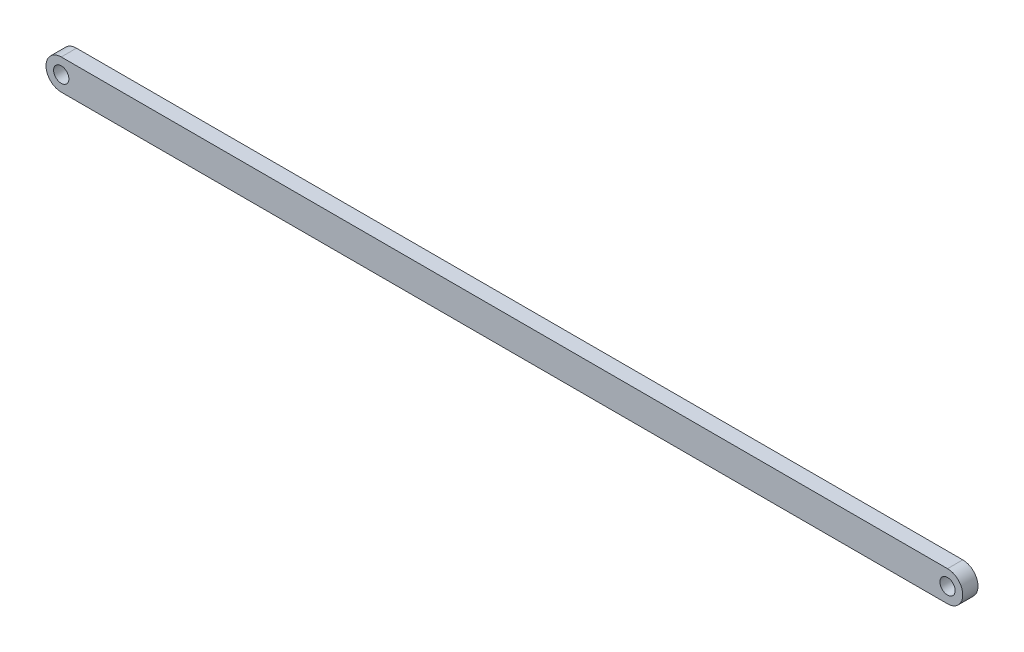
ISO-10303-21;
HEADER;
FILE_DESCRIPTION(('STEP AP214'),'2;1');
FILE_NAME('part.step','',(''),(''),'','','');
FILE_SCHEMA(('AUTOMOTIVE_DESIGN { 1 0 10303 214 1 1 1 1 }'));
ENDSEC;
DATA;
#1=APPLICATION_CONTEXT('core data for automotive mechanical design processes');
#2=APPLICATION_PROTOCOL_DEFINITION('international standard','automotive_design',2000,#1);
#3=PRODUCT_CONTEXT('',#1,'mechanical');
#4=PRODUCT('Part','Part','',(#3));
#5=PRODUCT_RELATED_PRODUCT_CATEGORY('part','',(#4));
#6=PRODUCT_DEFINITION_FORMATION('','',#4);
#7=PRODUCT_DEFINITION_CONTEXT('part definition',#1,'design');
#8=PRODUCT_DEFINITION('design','',#6,#7);
#9=PRODUCT_DEFINITION_SHAPE('','',#8);
#10=(LENGTH_UNIT() NAMED_UNIT(*) SI_UNIT(.MILLI.,.METRE.));
#11=(NAMED_UNIT(*) PLANE_ANGLE_UNIT() SI_UNIT($,.RADIAN.));
#12=(NAMED_UNIT(*) SI_UNIT($,.STERADIAN.) SOLID_ANGLE_UNIT());
#13=UNCERTAINTY_MEASURE_WITH_UNIT(LENGTH_MEASURE(1.E-05),#10,'distance_accuracy_value','');
#14=(GEOMETRIC_REPRESENTATION_CONTEXT(3) GLOBAL_UNCERTAINTY_ASSIGNED_CONTEXT((#13)) GLOBAL_UNIT_ASSIGNED_CONTEXT((#10,
#11,#12)) REPRESENTATION_CONTEXT('',''));
#15=CARTESIAN_POINT('',(0.,0.,0.));
#16=DIRECTION('',(0.,0.,1.));
#17=DIRECTION('',(1.,0.,0.));
#18=AXIS2_PLACEMENT_3D('',#15,#16,#17);
#19=CARTESIAN_POINT('',(145.38,0.,5.));
#20=DIRECTION('',(0.,0.,-1.));
#21=DIRECTION('',(-1.,0.,0.));
#22=AXIS2_PLACEMENT_3D('',#19,#20,#21);
#23=PLANE('',#22);
#24=CARTESIAN_POINT('',(145.38,0.,5.));
#25=DIRECTION('',(0.,0.,1.));
#26=DIRECTION('',(-1.,0.,0.));
#27=AXIS2_PLACEMENT_3D('',#24,#25,#26);
#28=CIRCLE('',#27,5.00000000000005);
#29=CARTESIAN_POINT('',(145.38,-5.00000000000005,5.));
#30=VERTEX_POINT('',#29);
#31=CARTESIAN_POINT('',(145.38,5.00000000000005,5.));
#32=VERTEX_POINT('',#31);
#33=EDGE_CURVE('E96',#30,#32,#28,.T.);
#34=ORIENTED_EDGE('',*,*,#33,.T.);
#35=DIRECTION('',(-1.,0.,0.));
#36=VECTOR('',#35,1.);
#37=CARTESIAN_POINT('',(-145.38,5.,5.));
#38=LINE('',#37,#36);
#39=CARTESIAN_POINT('',(-145.38,5.,5.));
#40=VERTEX_POINT('',#39);
#41=EDGE_CURVE('E91',#32,#40,#38,.T.);
#42=ORIENTED_EDGE('',*,*,#41,.T.);
#43=CARTESIAN_POINT('',(-145.38,0.,5.));
#44=DIRECTION('',(0.,0.,1.));
#45=DIRECTION('',(1.,0.,0.));
#46=AXIS2_PLACEMENT_3D('',#43,#44,#45);
#47=CIRCLE('',#46,5.00000000000005);
#48=CARTESIAN_POINT('',(-145.38,-5.00000000000005,5.));
#49=VERTEX_POINT('',#48);
#50=EDGE_CURVE('E94',#40,#49,#47,.T.);
#51=ORIENTED_EDGE('',*,*,#50,.T.);
#52=DIRECTION('',(1.,0.,0.));
#53=VECTOR('',#52,1.);
#54=CARTESIAN_POINT('',(-145.38,-5.00000000000011,5.));
#55=LINE('',#54,#53);
#56=EDGE_CURVE('E61',#49,#30,#55,.T.);
#57=ORIENTED_EDGE('',*,*,#56,.T.);
#58=EDGE_LOOP('',(#34,#42,#51,#57));
#59=FACE_BOUND('',#58,.T.);
#60=CARTESIAN_POINT('',(-145.38,0.,5.));
#61=DIRECTION('',(0.,0.,1.));
#62=DIRECTION('',(1.,0.,0.));
#63=AXIS2_PLACEMENT_3D('',#60,#61,#62);
#64=CIRCLE('',#63,2.5);
#65=CARTESIAN_POINT('',(-142.88,0.,5.));
#66=VERTEX_POINT('',#65);
#67=EDGE_CURVE('E116',#66,#66,#64,.T.);
#68=ORIENTED_EDGE('',*,*,#67,.F.);
#69=EDGE_LOOP('',(#68));
#70=FACE_BOUND('',#69,.T.);
#71=CARTESIAN_POINT('',(145.38,0.,5.));
#72=DIRECTION('',(0.,0.,1.));
#73=DIRECTION('',(1.,0.,0.));
#74=AXIS2_PLACEMENT_3D('',#71,#72,#73);
#75=CIRCLE('',#74,2.5);
#76=CARTESIAN_POINT('',(147.88,0.,5.));
#77=VERTEX_POINT('',#76);
#78=EDGE_CURVE('E138',#77,#77,#75,.T.);
#79=ORIENTED_EDGE('',*,*,#78,.F.);
#80=EDGE_LOOP('',(#79));
#81=FACE_BOUND('',#80,.T.);
#82=ADVANCED_FACE('F43',(#59,#70,#81),#23,.F.);
#83=CARTESIAN_POINT('',(145.38,0.,0.));
#84=DIRECTION('',(0.,0.,-1.));
#85=DIRECTION('',(-1.,0.,0.));
#86=AXIS2_PLACEMENT_3D('',#83,#84,#85);
#87=PLANE('',#86);
#88=CARTESIAN_POINT('',(-145.38,0.,0.));
#89=DIRECTION('',(0.,0.,1.));
#90=DIRECTION('',(1.,0.,0.));
#91=AXIS2_PLACEMENT_3D('',#88,#89,#90);
#92=CIRCLE('',#91,2.5);
#93=CARTESIAN_POINT('',(-142.88,0.,0.));
#94=VERTEX_POINT('',#93);
#95=EDGE_CURVE('E134',#94,#94,#92,.T.);
#96=ORIENTED_EDGE('',*,*,#95,.T.);
#97=EDGE_LOOP('',(#96));
#98=FACE_BOUND('',#97,.T.);
#99=CARTESIAN_POINT('',(145.38,0.,0.));
#100=DIRECTION('',(0.,0.,1.));
#101=DIRECTION('',(-1.,0.,0.));
#102=AXIS2_PLACEMENT_3D('',#99,#100,#101);
#103=CIRCLE('',#102,5.00000000000005);
#104=CARTESIAN_POINT('',(145.38,-5.00000000000005,0.));
#105=VERTEX_POINT('',#104);
#106=CARTESIAN_POINT('',(145.38,5.00000000000005,0.));
#107=VERTEX_POINT('',#106);
#108=EDGE_CURVE('E112',#105,#107,#103,.T.);
#109=ORIENTED_EDGE('',*,*,#108,.F.);
#110=DIRECTION('',(1.,0.,0.));
#111=VECTOR('',#110,1.);
#112=CARTESIAN_POINT('',(-145.38,-5.00000000000011,0.));
#113=LINE('',#112,#111);
#114=CARTESIAN_POINT('',(-145.38,-5.00000000000005,0.));
#115=VERTEX_POINT('',#114);
#116=EDGE_CURVE('E84',#115,#105,#113,.T.);
#117=ORIENTED_EDGE('',*,*,#116,.F.);
#118=CARTESIAN_POINT('',(-145.38,0.,0.));
#119=DIRECTION('',(0.,0.,1.));
#120=DIRECTION('',(1.,0.,0.));
#121=AXIS2_PLACEMENT_3D('',#118,#119,#120);
#122=CIRCLE('',#121,5.00000000000005);
#123=CARTESIAN_POINT('',(-145.38,5.,0.));
#124=VERTEX_POINT('',#123);
#125=EDGE_CURVE('E78',#124,#115,#122,.T.);
#126=ORIENTED_EDGE('',*,*,#125,.F.);
#127=DIRECTION('',(-1.,0.,0.));
#128=VECTOR('',#127,1.);
#129=CARTESIAN_POINT('',(-145.38,5.,0.));
#130=LINE('',#129,#128);
#131=EDGE_CURVE('E101',#107,#124,#130,.T.);
#132=ORIENTED_EDGE('',*,*,#131,.F.);
#133=EDGE_LOOP('',(#109,#117,#126,#132));
#134=FACE_BOUND('',#133,.T.);
#135=CARTESIAN_POINT('',(145.38,0.,0.));
#136=DIRECTION('',(0.,0.,1.));
#137=DIRECTION('',(1.,0.,0.));
#138=AXIS2_PLACEMENT_3D('',#135,#136,#137);
#139=CIRCLE('',#138,2.5);
#140=CARTESIAN_POINT('',(147.88,0.,0.));
#141=VERTEX_POINT('',#140);
#142=EDGE_CURVE('E142',#141,#141,#139,.T.);
#143=ORIENTED_EDGE('',*,*,#142,.T.);
#144=EDGE_LOOP('',(#143));
#145=FACE_BOUND('',#144,.T.);
#146=ADVANCED_FACE('F129',(#98,#134,#145),#87,.T.);
#147=CARTESIAN_POINT('',(145.38,0.,5.));
#148=DIRECTION('',(0.,0.,-1.));
#149=DIRECTION('',(-1.,0.,0.));
#150=AXIS2_PLACEMENT_3D('',#147,#148,#149);
#151=CYLINDRICAL_SURFACE('',#150,5.00000000000005);
#152=ORIENTED_EDGE('',*,*,#108,.T.);
#153=DIRECTION('',(0.,0.,-1.));
#154=VECTOR('',#153,1.);
#155=CARTESIAN_POINT('',(145.38,5.00000000000005,5.));
#156=LINE('',#155,#154);
#157=EDGE_CURVE('E11',#32,#107,#156,.T.);
#158=ORIENTED_EDGE('',*,*,#157,.F.);
#159=ORIENTED_EDGE('',*,*,#33,.F.);
#160=DIRECTION('',(0.,0.,-1.));
#161=VECTOR('',#160,1.);
#162=CARTESIAN_POINT('',(145.38,-5.00000000000005,5.));
#163=LINE('',#162,#161);
#164=EDGE_CURVE('E108',#30,#105,#163,.T.);
#165=ORIENTED_EDGE('',*,*,#164,.T.);
#166=EDGE_LOOP('',(#152,#158,#159,#165));
#167=FACE_BOUND('',#166,.T.);
#168=ADVANCED_FACE('F45',(#167),#151,.T.);
#169=CARTESIAN_POINT('',(-145.38,5.,5.));
#170=DIRECTION('',(0.,-1.,0.));
#171=DIRECTION('',(1.,0.,0.));
#172=AXIS2_PLACEMENT_3D('',#169,#170,#171);
#173=PLANE('',#172);
#174=ORIENTED_EDGE('',*,*,#131,.T.);
#175=DIRECTION('',(0.,0.,-1.));
#176=VECTOR('',#175,1.);
#177=CARTESIAN_POINT('',(-145.38,5.,5.));
#178=LINE('',#177,#176);
#179=EDGE_CURVE('E53',#40,#124,#178,.T.);
#180=ORIENTED_EDGE('',*,*,#179,.F.);
#181=ORIENTED_EDGE('',*,*,#41,.F.);
#182=ORIENTED_EDGE('',*,*,#157,.T.);
#183=EDGE_LOOP('',(#174,#180,#181,#182));
#184=FACE_BOUND('',#183,.T.);
#185=ADVANCED_FACE('F100',(#184),#173,.F.);
#186=CARTESIAN_POINT('',(-145.38,0.,5.));
#187=DIRECTION('',(0.,0.,-1.));
#188=DIRECTION('',(-1.,0.,0.));
#189=AXIS2_PLACEMENT_3D('',#186,#187,#188);
#190=CYLINDRICAL_SURFACE('',#189,5.00000000000005);
#191=ORIENTED_EDGE('',*,*,#125,.T.);
#192=DIRECTION('',(0.,0.,-1.));
#193=VECTOR('',#192,1.);
#194=CARTESIAN_POINT('',(-145.38,-5.00000000000005,5.));
#195=LINE('',#194,#193);
#196=EDGE_CURVE('E103',#49,#115,#195,.T.);
#197=ORIENTED_EDGE('',*,*,#196,.F.);
#198=ORIENTED_EDGE('',*,*,#50,.F.);
#199=ORIENTED_EDGE('',*,*,#179,.T.);
#200=EDGE_LOOP('',(#191,#197,#198,#199));
#201=FACE_BOUND('',#200,.T.);
#202=ADVANCED_FACE('F104',(#201),#190,.T.);
#203=CARTESIAN_POINT('',(-145.38,-5.00000000000011,5.));
#204=DIRECTION('',(0.,1.,0.));
#205=DIRECTION('',(-1.,0.,0.));
#206=AXIS2_PLACEMENT_3D('',#203,#204,#205);
#207=PLANE('',#206);
#208=ORIENTED_EDGE('',*,*,#116,.T.);
#209=ORIENTED_EDGE('',*,*,#164,.F.);
#210=ORIENTED_EDGE('',*,*,#56,.F.);
#211=ORIENTED_EDGE('',*,*,#196,.T.);
#212=EDGE_LOOP('',(#208,#209,#210,#211));
#213=FACE_BOUND('',#212,.T.);
#214=ADVANCED_FACE('F126',(#213),#207,.F.);
#215=CARTESIAN_POINT('',(-145.38,0.,5.));
#216=DIRECTION('',(0.,0.,-1.));
#217=DIRECTION('',(-1.,0.,0.));
#218=AXIS2_PLACEMENT_3D('',#215,#216,#217);
#219=CYLINDRICAL_SURFACE('',#218,2.5);
#220=ORIENTED_EDGE('',*,*,#67,.T.);
#221=EDGE_LOOP('',(#220));
#222=FACE_BOUND('',#221,.T.);
#223=ORIENTED_EDGE('',*,*,#95,.F.);
#224=EDGE_LOOP('',(#223));
#225=FACE_BOUND('',#224,.T.);
#226=ADVANCED_FACE('F161',(#222,#225),#219,.F.);
#227=CARTESIAN_POINT('',(145.38,0.,5.));
#228=DIRECTION('',(0.,0.,-1.));
#229=DIRECTION('',(-1.,0.,0.));
#230=AXIS2_PLACEMENT_3D('',#227,#228,#229);
#231=CYLINDRICAL_SURFACE('',#230,2.5);
#232=ORIENTED_EDGE('',*,*,#78,.T.);
#233=EDGE_LOOP('',(#232));
#234=FACE_BOUND('',#233,.T.);
#235=ORIENTED_EDGE('',*,*,#142,.F.);
#236=EDGE_LOOP('',(#235));
#237=FACE_BOUND('',#236,.T.);
#238=ADVANCED_FACE('F150',(#234,#237),#231,.F.);
#239=CLOSED_SHELL('',(#82,#146,#168,#185,#202,#214,#226,#238));
#240=MANIFOLD_SOLID_BREP('B2',#239);
#241=ADVANCED_BREP_SHAPE_REPRESENTATION('',(#18,#240),#14);
#242=SHAPE_DEFINITION_REPRESENTATION(#9,#241);
ENDSEC;
END-ISO-10303-21;
